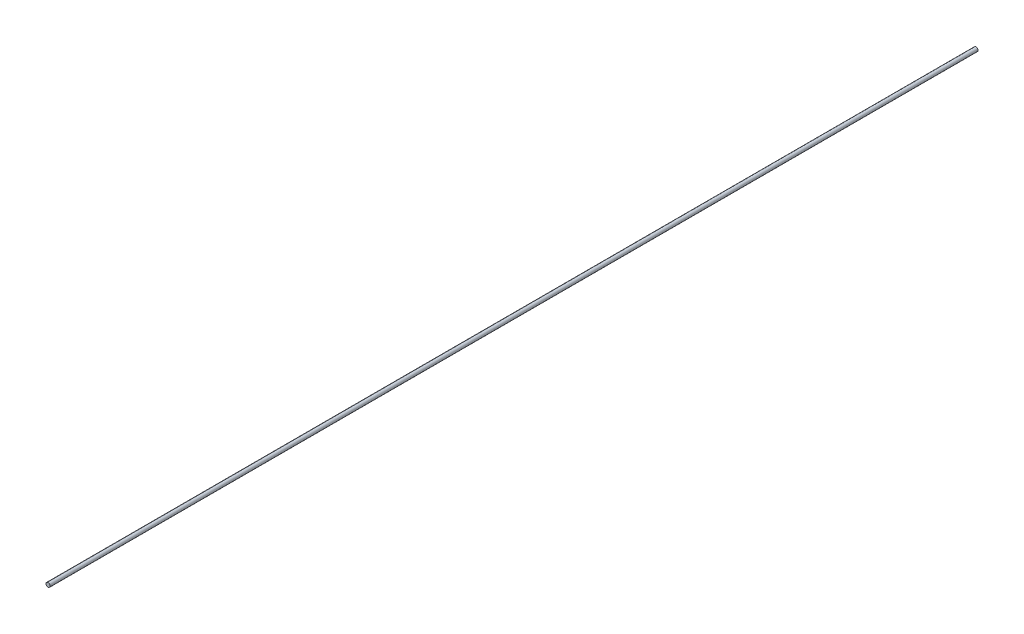
ISO-10303-21;
HEADER;
FILE_DESCRIPTION(('STEP AP214'),'2;1');
FILE_NAME('part.step','',(''),(''),'','','');
FILE_SCHEMA(('AUTOMOTIVE_DESIGN { 1 0 10303 214 1 1 1 1 }'));
ENDSEC;
DATA;
#1=APPLICATION_CONTEXT('core data for automotive mechanical design processes');
#2=APPLICATION_PROTOCOL_DEFINITION('international standard','automotive_design',2000,#1);
#3=PRODUCT_CONTEXT('',#1,'mechanical');
#4=PRODUCT('Part','Part','',(#3));
#5=PRODUCT_RELATED_PRODUCT_CATEGORY('part','',(#4));
#6=PRODUCT_DEFINITION_FORMATION('','',#4);
#7=PRODUCT_DEFINITION_CONTEXT('part definition',#1,'design');
#8=PRODUCT_DEFINITION('design','',#6,#7);
#9=PRODUCT_DEFINITION_SHAPE('','',#8);
#10=(LENGTH_UNIT() NAMED_UNIT(*) SI_UNIT(.MILLI.,.METRE.));
#11=(NAMED_UNIT(*) PLANE_ANGLE_UNIT() SI_UNIT($,.RADIAN.));
#12=(NAMED_UNIT(*) SI_UNIT($,.STERADIAN.) SOLID_ANGLE_UNIT());
#13=UNCERTAINTY_MEASURE_WITH_UNIT(LENGTH_MEASURE(1.E-05),#10,'distance_accuracy_value','');
#14=(GEOMETRIC_REPRESENTATION_CONTEXT(3) GLOBAL_UNCERTAINTY_ASSIGNED_CONTEXT((#13)) GLOBAL_UNIT_ASSIGNED_CONTEXT((#10,
#11,#12)) REPRESENTATION_CONTEXT('',''));
#15=CARTESIAN_POINT('',(0.,0.,0.));
#16=DIRECTION('',(0.,0.,1.));
#17=DIRECTION('',(1.,0.,0.));
#18=AXIS2_PLACEMENT_3D('',#15,#16,#17);
#19=CARTESIAN_POINT('',(0.,0.,915.));
#20=DIRECTION('',(0.,0.,-1.));
#21=DIRECTION('',(-1.,0.,0.));
#22=AXIS2_PLACEMENT_3D('',#19,#20,#21);
#23=CYLINDRICAL_SURFACE('',#22,2.);
#24=CARTESIAN_POINT('',(0.,0.,915.));
#25=DIRECTION('',(0.,0.,1.));
#26=DIRECTION('',(1.,0.,0.));
#27=AXIS2_PLACEMENT_3D('',#24,#25,#26);
#28=CIRCLE('',#27,2.);
#29=CARTESIAN_POINT('',(-2.,0.,915.));
#30=VERTEX_POINT('',#29);
#31=EDGE_CURVE('E10',#30,#30,#28,.T.);
#32=CARTESIAN_POINT('',(0.,0.,0.));
#33=DIRECTION('',(0.,0.,1.));
#34=DIRECTION('',(1.,0.,0.));
#35=AXIS2_PLACEMENT_3D('',#32,#33,#34);
#36=CIRCLE('',#35,2.);
#37=CARTESIAN_POINT('',(-2.,0.,-1.11022302462516E-13));
#38=VERTEX_POINT('',#37);
#39=EDGE_CURVE('E38',#38,#38,#36,.T.);
#40=CARTESIAN_POINT('',(-2.,0.,915.));
#41=CARTESIAN_POINT('',(-2.,0.,905.46875));
#42=CARTESIAN_POINT('',(-2.,0.,895.9375));
#43=CARTESIAN_POINT('',(-2.,0.,876.875));
#44=CARTESIAN_POINT('',(-2.,0.,867.34375));
#45=CARTESIAN_POINT('',(-2.,0.,848.28125));
#46=CARTESIAN_POINT('',(-2.,0.,838.75));
#47=CARTESIAN_POINT('',(-2.,0.,819.6875));
#48=CARTESIAN_POINT('',(-2.,0.,810.15625));
#49=CARTESIAN_POINT('',(-2.,0.,791.09375));
#50=CARTESIAN_POINT('',(-2.,0.,781.5625));
#51=CARTESIAN_POINT('',(-2.,0.,762.5));
#52=CARTESIAN_POINT('',(-2.,0.,752.96875));
#53=CARTESIAN_POINT('',(-2.,0.,733.90625));
#54=CARTESIAN_POINT('',(-2.,0.,724.375));
#55=CARTESIAN_POINT('',(-2.,0.,705.3125));
#56=CARTESIAN_POINT('',(-2.,0.,695.78125));
#57=CARTESIAN_POINT('',(-2.,0.,676.71875));
#58=CARTESIAN_POINT('',(-2.,0.,667.1875));
#59=CARTESIAN_POINT('',(-2.,0.,648.125));
#60=CARTESIAN_POINT('',(-2.,0.,638.59375));
#61=CARTESIAN_POINT('',(-2.,0.,619.53125));
#62=CARTESIAN_POINT('',(-2.,0.,610.));
#63=CARTESIAN_POINT('',(-2.,0.,590.9375));
#64=CARTESIAN_POINT('',(-2.,0.,581.40625));
#65=CARTESIAN_POINT('',(-2.,0.,562.34375));
#66=CARTESIAN_POINT('',(-2.,0.,552.8125));
#67=CARTESIAN_POINT('',(-2.,0.,533.75));
#68=CARTESIAN_POINT('',(-2.,0.,524.21875));
#69=CARTESIAN_POINT('',(-2.,0.,505.15625));
#70=CARTESIAN_POINT('',(-2.,0.,495.625));
#71=CARTESIAN_POINT('',(-2.,0.,476.5625));
#72=CARTESIAN_POINT('',(-2.,0.,467.03125));
#73=CARTESIAN_POINT('',(-2.,0.,447.96875));
#74=CARTESIAN_POINT('',(-2.,0.,438.4375));
#75=CARTESIAN_POINT('',(-2.,0.,419.375));
#76=CARTESIAN_POINT('',(-2.,0.,409.84375));
#77=CARTESIAN_POINT('',(-2.,0.,390.78125));
#78=CARTESIAN_POINT('',(-2.,0.,381.25));
#79=CARTESIAN_POINT('',(-2.,0.,362.1875));
#80=CARTESIAN_POINT('',(-2.,0.,352.65625));
#81=CARTESIAN_POINT('',(-2.,0.,333.59375));
#82=CARTESIAN_POINT('',(-2.,0.,324.0625));
#83=CARTESIAN_POINT('',(-2.,0.,305.));
#84=CARTESIAN_POINT('',(-2.,0.,295.46875));
#85=CARTESIAN_POINT('',(-2.,0.,276.40625));
#86=CARTESIAN_POINT('',(-2.,0.,266.875));
#87=CARTESIAN_POINT('',(-2.,0.,247.8125));
#88=CARTESIAN_POINT('',(-2.,0.,238.28125));
#89=CARTESIAN_POINT('',(-2.,0.,219.21875));
#90=CARTESIAN_POINT('',(-2.,0.,209.6875));
#91=CARTESIAN_POINT('',(-2.,0.,190.625));
#92=CARTESIAN_POINT('',(-2.,0.,181.09375));
#93=CARTESIAN_POINT('',(-2.,0.,162.03125));
#94=CARTESIAN_POINT('',(-2.,0.,152.5));
#95=CARTESIAN_POINT('',(-2.,0.,133.4375));
#96=CARTESIAN_POINT('',(-2.,0.,123.90625));
#97=CARTESIAN_POINT('',(-2.,0.,104.84375));
#98=CARTESIAN_POINT('',(-2.,0.,95.3124999999999));
#99=CARTESIAN_POINT('',(-2.,0.,76.2499999999999));
#100=CARTESIAN_POINT('',(-2.,0.,66.7187499999999));
#101=CARTESIAN_POINT('',(-2.,0.,47.6562499999999));
#102=CARTESIAN_POINT('',(-2.,0.,38.1249999999999));
#103=CARTESIAN_POINT('',(-2.,0.,19.0624999999999));
#104=CARTESIAN_POINT('',(-2.,0.,9.53124999999987));
#105=CARTESIAN_POINT('',(-2.,0.,-1.11022302462516E-13));
#106=B_SPLINE_CURVE_WITH_KNOTS('',3,(#40,#41,#42,#43,#44,#45,#46,#47,#48,#49,#50,#51,#52,#53,
#54,#55,#56,#57,#58,#59,#60,#61,#62,#63,#64,#65,#66,#67,#68,#69,#70,#71,#72,#73,#74,#75,#76,#77,
#78,#79,#80,#81,#82,#83,#84,#85,#86,#87,#88,#89,#90,#91,#92,#93,#94,#95,#96,#97,#98,#99,#100,
#101,#102,#103,#104,#105),.UNSPECIFIED.,.F.,.F.,(4,2,2,2,2,2,2,2,2,2,2,2,2,2,2,2,2,2,2,2,2,2,2,
2,2,2,2,2,2,2,2,2,4),(0.,28.5937500000001,57.1875000000001,85.78125,114.375,142.96875,171.5625,
200.15625,228.75,257.34375,285.9375,314.53125,343.125,371.71875,400.3125,428.90625,457.5,
486.09375,514.6875,543.28125,571.875,600.46875,629.0625,657.65625,686.25,714.84375,743.4375,
772.03125,800.625,829.21875,857.8125,886.40625,915.),.UNSPECIFIED.);
#107=EDGE_CURVE('BSEAM35',#30,#38,#106,.T.);
#108=ORIENTED_EDGE('',*,*,#31,.F.);
#109=ORIENTED_EDGE('',*,*,#39,.T.);
#110=ORIENTED_EDGE('',*,*,#107,.T.);
#111=ORIENTED_EDGE('',*,*,#107,.F.);
#112=EDGE_LOOP('',(#108,#110,#109,#111));
#113=FACE_BOUND('',#112,.T.);
#114=ADVANCED_FACE('F35',(#113),#23,.T.);
#115=CARTESIAN_POINT('',(0.,0.,915.));
#116=DIRECTION('',(0.,0.,1.));
#117=DIRECTION('',(1.,0.,0.));
#118=AXIS2_PLACEMENT_3D('',#115,#116,#117);
#119=PLANE('',#118);
#120=ORIENTED_EDGE('',*,*,#31,.T.);
#121=EDGE_LOOP('',(#120));
#122=FACE_BOUND('',#121,.T.);
#123=ADVANCED_FACE('F50',(#122),#119,.T.);
#124=CARTESIAN_POINT('',(0.,0.,0.));
#125=DIRECTION('',(0.,0.,1.));
#126=DIRECTION('',(1.,0.,0.));
#127=AXIS2_PLACEMENT_3D('',#124,#125,#126);
#128=PLANE('',#127);
#129=ORIENTED_EDGE('',*,*,#39,.F.);
#130=EDGE_LOOP('',(#129));
#131=FACE_BOUND('',#130,.T.);
#132=ADVANCED_FACE('F48',(#131),#128,.F.);
#133=CLOSED_SHELL('',(#114,#123,#132));
#134=MANIFOLD_SOLID_BREP('B2',#133);
#135=ADVANCED_BREP_SHAPE_REPRESENTATION('',(#18,#134),#14);
#136=SHAPE_DEFINITION_REPRESENTATION(#9,#135);
ENDSEC;
END-ISO-10303-21;
